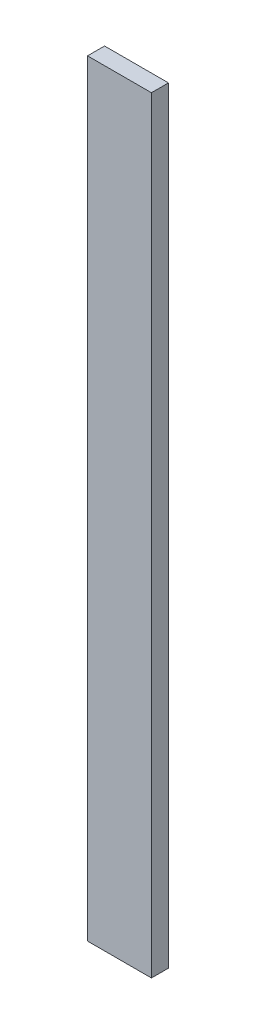
ISO-10303-21;
HEADER;
FILE_DESCRIPTION(('STEP AP214'),'2;1');
FILE_NAME('part.step','',(''),(''),'','','');
FILE_SCHEMA(('AUTOMOTIVE_DESIGN { 1 0 10303 214 1 1 1 1 }'));
ENDSEC;
DATA;
#1=APPLICATION_CONTEXT('core data for automotive mechanical design processes');
#2=APPLICATION_PROTOCOL_DEFINITION('international standard','automotive_design',2000,#1);
#3=PRODUCT_CONTEXT('',#1,'mechanical');
#4=PRODUCT('Part','Part','',(#3));
#5=PRODUCT_RELATED_PRODUCT_CATEGORY('part','',(#4));
#6=PRODUCT_DEFINITION_FORMATION('','',#4);
#7=PRODUCT_DEFINITION_CONTEXT('part definition',#1,'design');
#8=PRODUCT_DEFINITION('design','',#6,#7);
#9=PRODUCT_DEFINITION_SHAPE('','',#8);
#10=(LENGTH_UNIT() NAMED_UNIT(*) SI_UNIT(.MILLI.,.METRE.));
#11=(NAMED_UNIT(*) PLANE_ANGLE_UNIT() SI_UNIT($,.RADIAN.));
#12=(NAMED_UNIT(*) SI_UNIT($,.STERADIAN.) SOLID_ANGLE_UNIT());
#13=UNCERTAINTY_MEASURE_WITH_UNIT(LENGTH_MEASURE(1.E-05),#10,'distance_accuracy_value','');
#14=(GEOMETRIC_REPRESENTATION_CONTEXT(3) GLOBAL_UNCERTAINTY_ASSIGNED_CONTEXT((#13)) GLOBAL_UNIT_ASSIGNED_CONTEXT((#10,
#11,#12)) REPRESENTATION_CONTEXT('',''));
#15=CARTESIAN_POINT('',(0.,0.,0.));
#16=DIRECTION('',(0.,0.,1.));
#17=DIRECTION('',(1.,0.,0.));
#18=AXIS2_PLACEMENT_3D('',#15,#16,#17);
#19=CARTESIAN_POINT('',(15.,180.,8.));
#20=DIRECTION('',(-1.,0.,0.));
#21=DIRECTION('',(0.,-1.,0.));
#22=AXIS2_PLACEMENT_3D('',#19,#20,#21);
#23=PLANE('',#22);
#24=DIRECTION('',(0.,1.,0.));
#25=VECTOR('',#24,1.);
#26=CARTESIAN_POINT('',(15.,180.,0.));
#27=LINE('',#26,#25);
#28=CARTESIAN_POINT('',(15.0000000000001,-180.,0.));
#29=VERTEX_POINT('',#28);
#30=CARTESIAN_POINT('',(15.,180.,0.));
#31=VERTEX_POINT('',#30);
#32=EDGE_CURVE('E113',#29,#31,#27,.T.);
#33=ORIENTED_EDGE('',*,*,#32,.T.);
#34=DIRECTION('',(0.,0.,-1.));
#35=VECTOR('',#34,1.);
#36=CARTESIAN_POINT('',(15.,180.,8.));
#37=LINE('',#36,#35);
#38=CARTESIAN_POINT('',(15.,180.,8.));
#39=VERTEX_POINT('',#38);
#40=EDGE_CURVE('E11',#39,#31,#37,.T.);
#41=ORIENTED_EDGE('',*,*,#40,.F.);
#42=DIRECTION('',(0.,1.,0.));
#43=VECTOR('',#42,1.);
#44=CARTESIAN_POINT('',(15.,180.,8.));
#45=LINE('',#44,#43);
#46=CARTESIAN_POINT('',(15.0000000000001,-180.,8.));
#47=VERTEX_POINT('',#46);
#48=EDGE_CURVE('E97',#47,#39,#45,.T.);
#49=ORIENTED_EDGE('',*,*,#48,.F.);
#50=DIRECTION('',(0.,0.,-1.));
#51=VECTOR('',#50,1.);
#52=CARTESIAN_POINT('',(15.0000000000001,-180.,8.));
#53=LINE('',#52,#51);
#54=EDGE_CURVE('E109',#47,#29,#53,.T.);
#55=ORIENTED_EDGE('',*,*,#54,.T.);
#56=EDGE_LOOP('',(#33,#41,#49,#55));
#57=FACE_BOUND('',#56,.T.);
#58=ADVANCED_FACE('F45',(#57),#23,.F.);
#59=CARTESIAN_POINT('',(-15.,180.,8.));
#60=DIRECTION('',(0.,-1.,0.));
#61=DIRECTION('',(0.,0.,-1.));
#62=AXIS2_PLACEMENT_3D('',#59,#60,#61);
#63=PLANE('',#62);
#64=DIRECTION('',(-1.,0.,0.));
#65=VECTOR('',#64,1.);
#66=CARTESIAN_POINT('',(-15.,180.,0.));
#67=LINE('',#66,#65);
#68=CARTESIAN_POINT('',(-15.,180.,0.));
#69=VERTEX_POINT('',#68);
#70=EDGE_CURVE('E102',#31,#69,#67,.T.);
#71=ORIENTED_EDGE('',*,*,#70,.T.);
#72=DIRECTION('',(0.,0.,-1.));
#73=VECTOR('',#72,1.);
#74=CARTESIAN_POINT('',(-15.,180.,8.));
#75=LINE('',#74,#73);
#76=CARTESIAN_POINT('',(-15.,180.,8.));
#77=VERTEX_POINT('',#76);
#78=EDGE_CURVE('E54',#77,#69,#75,.T.);
#79=ORIENTED_EDGE('',*,*,#78,.F.);
#80=DIRECTION('',(-1.,0.,0.));
#81=VECTOR('',#80,1.);
#82=CARTESIAN_POINT('',(-15.,180.,8.));
#83=LINE('',#82,#81);
#84=EDGE_CURVE('E92',#39,#77,#83,.T.);
#85=ORIENTED_EDGE('',*,*,#84,.F.);
#86=ORIENTED_EDGE('',*,*,#40,.T.);
#87=EDGE_LOOP('',(#71,#79,#85,#86));
#88=FACE_BOUND('',#87,.T.);
#89=ADVANCED_FACE('F101',(#88),#63,.F.);
#90=CARTESIAN_POINT('',(-15.,180.,8.));
#91=DIRECTION('',(1.,0.,0.));
#92=DIRECTION('',(0.,1.,0.));
#93=AXIS2_PLACEMENT_3D('',#90,#91,#92);
#94=PLANE('',#93);
#95=DIRECTION('',(0.,-1.,0.));
#96=VECTOR('',#95,1.);
#97=CARTESIAN_POINT('',(-15.,180.,0.));
#98=LINE('',#97,#96);
#99=CARTESIAN_POINT('',(-14.9999999999999,-180.,0.));
#100=VERTEX_POINT('',#99);
#101=EDGE_CURVE('E79',#69,#100,#98,.T.);
#102=ORIENTED_EDGE('',*,*,#101,.T.);
#103=DIRECTION('',(0.,0.,-1.));
#104=VECTOR('',#103,1.);
#105=CARTESIAN_POINT('',(-14.9999999999999,-180.,8.));
#106=LINE('',#105,#104);
#107=CARTESIAN_POINT('',(-14.9999999999999,-180.,8.));
#108=VERTEX_POINT('',#107);
#109=EDGE_CURVE('E104',#108,#100,#106,.T.);
#110=ORIENTED_EDGE('',*,*,#109,.F.);
#111=DIRECTION('',(0.,-1.,0.));
#112=VECTOR('',#111,1.);
#113=CARTESIAN_POINT('',(-15.,180.,8.));
#114=LINE('',#113,#112);
#115=EDGE_CURVE('E95',#77,#108,#114,.T.);
#116=ORIENTED_EDGE('',*,*,#115,.F.);
#117=ORIENTED_EDGE('',*,*,#78,.T.);
#118=EDGE_LOOP('',(#102,#110,#116,#117));
#119=FACE_BOUND('',#118,.T.);
#120=ADVANCED_FACE('F105',(#119),#94,.F.);
#121=CARTESIAN_POINT('',(-14.9999999999999,-180.,8.));
#122=DIRECTION('',(0.,1.,0.));
#123=DIRECTION('',(0.,0.,1.));
#124=AXIS2_PLACEMENT_3D('',#121,#122,#123);
#125=PLANE('',#124);
#126=DIRECTION('',(1.,0.,0.));
#127=VECTOR('',#126,1.);
#128=CARTESIAN_POINT('',(-14.9999999999999,-180.,0.));
#129=LINE('',#128,#127);
#130=EDGE_CURVE('E85',#100,#29,#129,.T.);
#131=ORIENTED_EDGE('',*,*,#130,.T.);
#132=ORIENTED_EDGE('',*,*,#54,.F.);
#133=DIRECTION('',(1.,0.,0.));
#134=VECTOR('',#133,1.);
#135=CARTESIAN_POINT('',(-14.9999999999999,-180.,8.));
#136=LINE('',#135,#134);
#137=EDGE_CURVE('E62',#108,#47,#136,.T.);
#138=ORIENTED_EDGE('',*,*,#137,.F.);
#139=ORIENTED_EDGE('',*,*,#109,.T.);
#140=EDGE_LOOP('',(#131,#132,#138,#139));
#141=FACE_BOUND('',#140,.T.);
#142=ADVANCED_FACE('F126',(#141),#125,.F.);
#143=CARTESIAN_POINT('',(0.,0.,8.));
#144=DIRECTION('',(0.,0.,1.));
#145=DIRECTION('',(1.,0.,0.));
#146=AXIS2_PLACEMENT_3D('',#143,#144,#145);
#147=PLANE('',#146);
#148=ORIENTED_EDGE('',*,*,#48,.T.);
#149=ORIENTED_EDGE('',*,*,#84,.T.);
#150=ORIENTED_EDGE('',*,*,#115,.T.);
#151=ORIENTED_EDGE('',*,*,#137,.T.);
#152=EDGE_LOOP('',(#148,#149,#150,#151));
#153=FACE_BOUND('',#152,.T.);
#154=ADVANCED_FACE('F93',(#153),#147,.T.);
#155=CARTESIAN_POINT('',(0.,0.,0.));
#156=DIRECTION('',(0.,0.,1.));
#157=DIRECTION('',(1.,0.,0.));
#158=AXIS2_PLACEMENT_3D('',#155,#156,#157);
#159=PLANE('',#158);
#160=ORIENTED_EDGE('',*,*,#32,.F.);
#161=ORIENTED_EDGE('',*,*,#130,.F.);
#162=ORIENTED_EDGE('',*,*,#101,.F.);
#163=ORIENTED_EDGE('',*,*,#70,.F.);
#164=EDGE_LOOP('',(#160,#161,#162,#163));
#165=FACE_BOUND('',#164,.T.);
#166=ADVANCED_FACE('F129',(#165),#159,.F.);
#167=CLOSED_SHELL('',(#58,#89,#120,#142,#154,#166));
#168=MANIFOLD_SOLID_BREP('B2',#167);
#169=ADVANCED_BREP_SHAPE_REPRESENTATION('',(#18,#168),#14);
#170=SHAPE_DEFINITION_REPRESENTATION(#9,#169);
ENDSEC;
END-ISO-10303-21;
